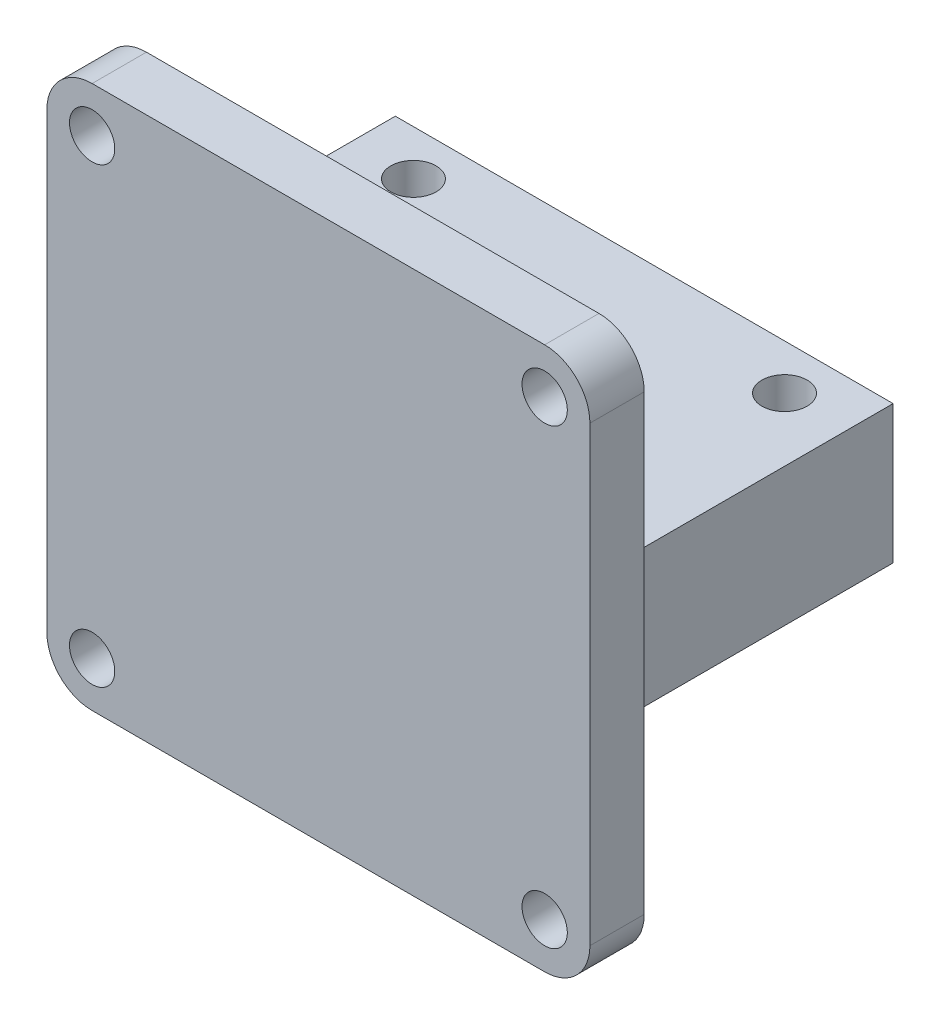
ISO-10303-21;
HEADER;
FILE_DESCRIPTION(('STEP AP214'),'2;1');
FILE_NAME('part.step','',(''),(''),'','','');
FILE_SCHEMA(('AUTOMOTIVE_DESIGN { 1 0 10303 214 1 1 1 1 }'));
ENDSEC;
DATA;
#1=APPLICATION_CONTEXT('core data for automotive mechanical design processes');
#2=APPLICATION_PROTOCOL_DEFINITION('international standard','automotive_design',2000,#1);
#3=PRODUCT_CONTEXT('',#1,'mechanical');
#4=PRODUCT('Part','Part','',(#3));
#5=PRODUCT_RELATED_PRODUCT_CATEGORY('part','',(#4));
#6=PRODUCT_DEFINITION_FORMATION('','',#4);
#7=PRODUCT_DEFINITION_CONTEXT('part definition',#1,'design');
#8=PRODUCT_DEFINITION('design','',#6,#7);
#9=PRODUCT_DEFINITION_SHAPE('','',#8);
#10=(LENGTH_UNIT() NAMED_UNIT(*) SI_UNIT(.MILLI.,.METRE.));
#11=(NAMED_UNIT(*) PLANE_ANGLE_UNIT() SI_UNIT($,.RADIAN.));
#12=(NAMED_UNIT(*) SI_UNIT($,.STERADIAN.) SOLID_ANGLE_UNIT());
#13=UNCERTAINTY_MEASURE_WITH_UNIT(LENGTH_MEASURE(1.E-05),#10,'distance_accuracy_value','');
#14=(GEOMETRIC_REPRESENTATION_CONTEXT(3) GLOBAL_UNCERTAINTY_ASSIGNED_CONTEXT((#13)) GLOBAL_UNIT_ASSIGNED_CONTEXT((#10,
#11,#12)) REPRESENTATION_CONTEXT('',''));
#15=CARTESIAN_POINT('',(0.,0.,0.));
#16=DIRECTION('',(0.,0.,1.));
#17=DIRECTION('',(1.,0.,0.));
#18=AXIS2_PLACEMENT_3D('',#15,#16,#17);
#19=CARTESIAN_POINT('',(0.,0.,0.));
#20=DIRECTION('',(0.,0.,1.));
#21=DIRECTION('',(1.,0.,0.));
#22=AXIS2_PLACEMENT_3D('',#19,#20,#21);
#23=PLANE('',#22);
#24=CARTESIAN_POINT('',(-25.,25.,0.));
#25=DIRECTION('',(0.,0.,-1.));
#26=DIRECTION('',(-1.,0.,0.));
#27=AXIS2_PLACEMENT_3D('',#24,#25,#26);
#28=CIRCLE('',#27,2.5);
#29=CARTESIAN_POINT('',(-27.5,25.,0.));
#30=VERTEX_POINT('',#29);
#31=EDGE_CURVE('E245',#30,#30,#28,.T.);
#32=ORIENTED_EDGE('',*,*,#31,.F.);
#33=EDGE_LOOP('',(#32));
#34=FACE_BOUND('',#33,.T.);
#35=CARTESIAN_POINT('',(25.,25.,0.));
#36=DIRECTION('',(0.,0.,-1.));
#37=DIRECTION('',(-1.,0.,0.));
#38=AXIS2_PLACEMENT_3D('',#35,#36,#37);
#39=CIRCLE('',#38,2.5);
#40=CARTESIAN_POINT('',(22.5,25.,0.));
#41=VERTEX_POINT('',#40);
#42=EDGE_CURVE('E280',#41,#41,#39,.T.);
#43=ORIENTED_EDGE('',*,*,#42,.F.);
#44=EDGE_LOOP('',(#43));
#45=FACE_BOUND('',#44,.T.);
#46=CARTESIAN_POINT('',(-25.,-25.,0.));
#47=DIRECTION('',(0.,0.,-1.));
#48=DIRECTION('',(-1.,0.,0.));
#49=AXIS2_PLACEMENT_3D('',#46,#47,#48);
#50=CIRCLE('',#49,2.5);
#51=CARTESIAN_POINT('',(-27.5,-25.,0.));
#52=VERTEX_POINT('',#51);
#53=EDGE_CURVE('E288',#52,#52,#50,.T.);
#54=ORIENTED_EDGE('',*,*,#53,.F.);
#55=EDGE_LOOP('',(#54));
#56=FACE_BOUND('',#55,.T.);
#57=CARTESIAN_POINT('',(25.,-25.,0.));
#58=DIRECTION('',(0.,0.,-1.));
#59=DIRECTION('',(-1.,0.,0.));
#60=AXIS2_PLACEMENT_3D('',#57,#58,#59);
#61=CIRCLE('',#60,2.5);
#62=CARTESIAN_POINT('',(22.5,-25.,0.));
#63=VERTEX_POINT('',#62);
#64=EDGE_CURVE('E296',#63,#63,#61,.T.);
#65=ORIENTED_EDGE('',*,*,#64,.F.);
#66=EDGE_LOOP('',(#65));
#67=FACE_BOUND('',#66,.T.);
#68=DIRECTION('',(0.,-1.,0.));
#69=VECTOR('',#68,1.);
#70=CARTESIAN_POINT('',(-30.,30.,0.));
#71=LINE('',#70,#69);
#72=CARTESIAN_POINT('',(-30.,25.,0.));
#73=VERTEX_POINT('',#72);
#74=CARTESIAN_POINT('',(-30.,-25.,0.));
#75=VERTEX_POINT('',#74);
#76=EDGE_CURVE('E191',#73,#75,#71,.T.);
#77=ORIENTED_EDGE('',*,*,#76,.F.);
#78=CARTESIAN_POINT('',(-25.,25.,0.));
#79=DIRECTION('',(0.,0.,1.));
#80=DIRECTION('',(1.,0.,0.));
#81=AXIS2_PLACEMENT_3D('',#78,#79,#80);
#82=CIRCLE('',#81,5.);
#83=CARTESIAN_POINT('',(-25.,30.,0.));
#84=VERTEX_POINT('',#83);
#85=EDGE_CURVE('E212',#73,#84,#82,.F.);
#86=ORIENTED_EDGE('',*,*,#85,.T.);
#87=DIRECTION('',(-1.,0.,0.));
#88=VECTOR('',#87,1.);
#89=CARTESIAN_POINT('',(-30.,30.,0.));
#90=LINE('',#89,#88);
#91=CARTESIAN_POINT('',(25.,30.,0.));
#92=VERTEX_POINT('',#91);
#93=EDGE_CURVE('E166',#92,#84,#90,.T.);
#94=ORIENTED_EDGE('',*,*,#93,.F.);
#95=CARTESIAN_POINT('',(25.,25.,0.));
#96=DIRECTION('',(0.,0.,1.));
#97=DIRECTION('',(1.,0.,0.));
#98=AXIS2_PLACEMENT_3D('',#95,#96,#97);
#99=CIRCLE('',#98,5.);
#100=CARTESIAN_POINT('',(30.,25.,0.));
#101=VERTEX_POINT('',#100);
#102=EDGE_CURVE('E203',#92,#101,#99,.F.);
#103=ORIENTED_EDGE('',*,*,#102,.T.);
#104=DIRECTION('',(0.,1.,0.));
#105=VECTOR('',#104,1.);
#106=CARTESIAN_POINT('',(30.,30.,0.));
#107=LINE('',#106,#105);
#108=CARTESIAN_POINT('',(30.,-25.,0.));
#109=VERTEX_POINT('',#108);
#110=EDGE_CURVE('E161',#109,#101,#107,.T.);
#111=ORIENTED_EDGE('',*,*,#110,.F.);
#112=CARTESIAN_POINT('',(25.,-25.,0.));
#113=DIRECTION('',(0.,0.,1.));
#114=DIRECTION('',(1.,0.,0.));
#115=AXIS2_PLACEMENT_3D('',#112,#113,#114);
#116=CIRCLE('',#115,5.);
#117=CARTESIAN_POINT('',(25.,-30.,0.));
#118=VERTEX_POINT('',#117);
#119=EDGE_CURVE('E206',#109,#118,#116,.F.);
#120=ORIENTED_EDGE('',*,*,#119,.T.);
#121=DIRECTION('',(1.,0.,0.));
#122=VECTOR('',#121,1.);
#123=CARTESIAN_POINT('',(-30.,-30.,0.));
#124=LINE('',#123,#122);
#125=CARTESIAN_POINT('',(-25.,-30.,0.));
#126=VERTEX_POINT('',#125);
#127=EDGE_CURVE('E177',#126,#118,#124,.T.);
#128=ORIENTED_EDGE('',*,*,#127,.F.);
#129=CARTESIAN_POINT('',(-25.,-25.,0.));
#130=DIRECTION('',(0.,0.,1.));
#131=DIRECTION('',(1.,0.,0.));
#132=AXIS2_PLACEMENT_3D('',#129,#130,#131);
#133=CIRCLE('',#132,5.);
#134=EDGE_CURVE('E209',#126,#75,#133,.F.);
#135=ORIENTED_EDGE('',*,*,#134,.T.);
#136=EDGE_LOOP('',(#77,#86,#94,#103,#111,#120,#128,#135));
#137=FACE_BOUND('',#136,.T.);
#138=DIRECTION('',(0.,1.,0.));
#139=VECTOR('',#138,1.);
#140=CARTESIAN_POINT('',(-27.5,7.625,0.));
#141=LINE('',#140,#139);
#142=CARTESIAN_POINT('',(-27.5,-7.625,0.));
#143=VERTEX_POINT('',#142);
#144=CARTESIAN_POINT('',(-27.5,7.625,0.));
#145=VERTEX_POINT('',#144);
#146=EDGE_CURVE('E159',#143,#145,#141,.T.);
#147=ORIENTED_EDGE('',*,*,#146,.F.);
#148=DIRECTION('',(-1.,0.,0.));
#149=VECTOR('',#148,1.);
#150=CARTESIAN_POINT('',(27.5,-7.625,0.));
#151=LINE('',#150,#149);
#152=CARTESIAN_POINT('',(27.5,-7.625,0.));
#153=VERTEX_POINT('',#152);
#154=EDGE_CURVE('E156',#153,#143,#151,.T.);
#155=ORIENTED_EDGE('',*,*,#154,.F.);
#156=DIRECTION('',(0.,-1.,0.));
#157=VECTOR('',#156,1.);
#158=CARTESIAN_POINT('',(27.5,7.625,0.));
#159=LINE('',#158,#157);
#160=CARTESIAN_POINT('',(27.5,7.625,0.));
#161=VERTEX_POINT('',#160);
#162=EDGE_CURVE('E314',#161,#153,#159,.T.);
#163=ORIENTED_EDGE('',*,*,#162,.F.);
#164=DIRECTION('',(1.,0.,0.));
#165=VECTOR('',#164,1.);
#166=CARTESIAN_POINT('',(27.5,7.625,0.));
#167=LINE('',#166,#165);
#168=EDGE_CURVE('E311',#145,#161,#167,.T.);
#169=ORIENTED_EDGE('',*,*,#168,.F.);
#170=EDGE_LOOP('',(#147,#155,#163,#169));
#171=FACE_BOUND('',#170,.T.);
#172=ADVANCED_FACE('F39',(#34,#45,#56,#67,#137,#171),#23,.F.);
#173=CARTESIAN_POINT('',(30.,30.,6.));
#174=DIRECTION('',(-1.,0.,0.));
#175=DIRECTION('',(0.,-1.,0.));
#176=AXIS2_PLACEMENT_3D('',#173,#174,#175);
#177=PLANE('',#176);
#178=DIRECTION('',(0.,1.,0.));
#179=VECTOR('',#178,1.);
#180=CARTESIAN_POINT('',(30.,30.,6.));
#181=LINE('',#180,#179);
#182=CARTESIAN_POINT('',(30.,-25.,6.));
#183=VERTEX_POINT('',#182);
#184=CARTESIAN_POINT('',(30.,25.,6.));
#185=VERTEX_POINT('',#184);
#186=EDGE_CURVE('E172',#183,#185,#181,.T.);
#187=ORIENTED_EDGE('',*,*,#186,.F.);
#188=DIRECTION('',(0.,0.,-1.));
#189=VECTOR('',#188,1.);
#190=CARTESIAN_POINT('',(30.,-25.,6.));
#191=LINE('',#190,#189);
#192=EDGE_CURVE('E11',#183,#109,#191,.T.);
#193=ORIENTED_EDGE('',*,*,#192,.T.);
#194=ORIENTED_EDGE('',*,*,#110,.T.);
#195=DIRECTION('',(0.,0.,-1.));
#196=VECTOR('',#195,1.);
#197=CARTESIAN_POINT('',(30.,25.,6.));
#198=LINE('',#197,#196);
#199=EDGE_CURVE('E49',#101,#185,#198,.F.);
#200=ORIENTED_EDGE('',*,*,#199,.T.);
#201=EDGE_LOOP('',(#187,#193,#194,#200));
#202=FACE_BOUND('',#201,.T.);
#203=ADVANCED_FACE('F331',(#202),#177,.F.);
#204=CARTESIAN_POINT('',(-30.,30.,6.));
#205=DIRECTION('',(0.,-1.,0.));
#206=DIRECTION('',(0.,0.,-1.));
#207=AXIS2_PLACEMENT_3D('',#204,#205,#206);
#208=PLANE('',#207);
#209=ORIENTED_EDGE('',*,*,#93,.T.);
#210=DIRECTION('',(0.,0.,-1.));
#211=VECTOR('',#210,1.);
#212=CARTESIAN_POINT('',(-25.,30.,6.));
#213=LINE('',#212,#211);
#214=CARTESIAN_POINT('',(-25.,30.,6.));
#215=VERTEX_POINT('',#214);
#216=EDGE_CURVE('E219',#84,#215,#213,.F.);
#217=ORIENTED_EDGE('',*,*,#216,.T.);
#218=DIRECTION('',(-1.,0.,0.));
#219=VECTOR('',#218,1.);
#220=CARTESIAN_POINT('',(-30.,30.,6.));
#221=LINE('',#220,#219);
#222=CARTESIAN_POINT('',(25.,30.,6.));
#223=VERTEX_POINT('',#222);
#224=EDGE_CURVE('E176',#223,#215,#221,.T.);
#225=ORIENTED_EDGE('',*,*,#224,.F.);
#226=DIRECTION('',(0.,0.,-1.));
#227=VECTOR('',#226,1.);
#228=CARTESIAN_POINT('',(25.,30.,6.));
#229=LINE('',#228,#227);
#230=EDGE_CURVE('E215',#223,#92,#229,.T.);
#231=ORIENTED_EDGE('',*,*,#230,.T.);
#232=EDGE_LOOP('',(#209,#217,#225,#231));
#233=FACE_BOUND('',#232,.T.);
#234=ADVANCED_FACE('F337',(#233),#208,.F.);
#235=CARTESIAN_POINT('',(-30.,30.,6.));
#236=DIRECTION('',(1.,0.,0.));
#237=DIRECTION('',(0.,1.,0.));
#238=AXIS2_PLACEMENT_3D('',#235,#236,#237);
#239=PLANE('',#238);
#240=DIRECTION('',(0.,-1.,0.));
#241=VECTOR('',#240,1.);
#242=CARTESIAN_POINT('',(-30.,30.,6.));
#243=LINE('',#242,#241);
#244=CARTESIAN_POINT('',(-30.,25.,6.));
#245=VERTEX_POINT('',#244);
#246=CARTESIAN_POINT('',(-30.,-25.,6.));
#247=VERTEX_POINT('',#246);
#248=EDGE_CURVE('E181',#245,#247,#243,.T.);
#249=ORIENTED_EDGE('',*,*,#248,.F.);
#250=DIRECTION('',(0.,0.,-1.));
#251=VECTOR('',#250,1.);
#252=CARTESIAN_POINT('',(-30.,25.,6.));
#253=LINE('',#252,#251);
#254=EDGE_CURVE('E199',#245,#73,#253,.T.);
#255=ORIENTED_EDGE('',*,*,#254,.T.);
#256=ORIENTED_EDGE('',*,*,#76,.T.);
#257=DIRECTION('',(0.,0.,-1.));
#258=VECTOR('',#257,1.);
#259=CARTESIAN_POINT('',(-30.,-25.,6.));
#260=LINE('',#259,#258);
#261=EDGE_CURVE('E186',#75,#247,#260,.F.);
#262=ORIENTED_EDGE('',*,*,#261,.T.);
#263=EDGE_LOOP('',(#249,#255,#256,#262));
#264=FACE_BOUND('',#263,.T.);
#265=ADVANCED_FACE('F349',(#264),#239,.F.);
#266=CARTESIAN_POINT('',(-30.,-30.,6.));
#267=DIRECTION('',(0.,1.,0.));
#268=DIRECTION('',(0.,0.,1.));
#269=AXIS2_PLACEMENT_3D('',#266,#267,#268);
#270=PLANE('',#269);
#271=DIRECTION('',(1.,0.,0.));
#272=VECTOR('',#271,1.);
#273=CARTESIAN_POINT('',(-30.,-30.,6.));
#274=LINE('',#273,#272);
#275=CARTESIAN_POINT('',(-25.,-30.,6.));
#276=VERTEX_POINT('',#275);
#277=CARTESIAN_POINT('',(25.,-30.,6.));
#278=VERTEX_POINT('',#277);
#279=EDGE_CURVE('E184',#276,#278,#274,.T.);
#280=ORIENTED_EDGE('',*,*,#279,.F.);
#281=DIRECTION('',(0.,0.,-1.));
#282=VECTOR('',#281,1.);
#283=CARTESIAN_POINT('',(-25.,-30.,6.));
#284=LINE('',#283,#282);
#285=EDGE_CURVE('E235',#276,#126,#284,.T.);
#286=ORIENTED_EDGE('',*,*,#285,.T.);
#287=ORIENTED_EDGE('',*,*,#127,.T.);
#288=DIRECTION('',(0.,0.,-1.));
#289=VECTOR('',#288,1.);
#290=CARTESIAN_POINT('',(25.,-30.,6.));
#291=LINE('',#290,#289);
#292=EDGE_CURVE('E57',#118,#278,#291,.F.);
#293=ORIENTED_EDGE('',*,*,#292,.T.);
#294=EDGE_LOOP('',(#280,#286,#287,#293));
#295=FACE_BOUND('',#294,.T.);
#296=ADVANCED_FACE('F346',(#295),#270,.F.);
#297=CARTESIAN_POINT('',(0.,0.,6.));
#298=DIRECTION('',(0.,0.,1.));
#299=DIRECTION('',(1.,0.,0.));
#300=AXIS2_PLACEMENT_3D('',#297,#298,#299);
#301=PLANE('',#300);
#302=CARTESIAN_POINT('',(-25.,25.,6.));
#303=DIRECTION('',(0.,0.,-1.));
#304=DIRECTION('',(-1.,0.,0.));
#305=AXIS2_PLACEMENT_3D('',#302,#303,#304);
#306=CIRCLE('',#305,2.5);
#307=CARTESIAN_POINT('',(-27.5,25.,6.));
#308=VERTEX_POINT('',#307);
#309=EDGE_CURVE('E276',#308,#308,#306,.T.);
#310=ORIENTED_EDGE('',*,*,#309,.T.);
#311=EDGE_LOOP('',(#310));
#312=FACE_BOUND('',#311,.T.);
#313=CARTESIAN_POINT('',(25.,25.,6.));
#314=DIRECTION('',(0.,0.,-1.));
#315=DIRECTION('',(-1.,0.,0.));
#316=AXIS2_PLACEMENT_3D('',#313,#314,#315);
#317=CIRCLE('',#316,2.5);
#318=CARTESIAN_POINT('',(22.5,25.,6.));
#319=VERTEX_POINT('',#318);
#320=EDGE_CURVE('E284',#319,#319,#317,.T.);
#321=ORIENTED_EDGE('',*,*,#320,.T.);
#322=EDGE_LOOP('',(#321));
#323=FACE_BOUND('',#322,.T.);
#324=CARTESIAN_POINT('',(-25.,-25.,6.));
#325=DIRECTION('',(0.,0.,-1.));
#326=DIRECTION('',(-1.,0.,0.));
#327=AXIS2_PLACEMENT_3D('',#324,#325,#326);
#328=CIRCLE('',#327,2.5);
#329=CARTESIAN_POINT('',(-27.5,-25.,6.));
#330=VERTEX_POINT('',#329);
#331=EDGE_CURVE('E292',#330,#330,#328,.T.);
#332=ORIENTED_EDGE('',*,*,#331,.T.);
#333=EDGE_LOOP('',(#332));
#334=FACE_BOUND('',#333,.T.);
#335=CARTESIAN_POINT('',(25.,-25.,6.));
#336=DIRECTION('',(0.,0.,-1.));
#337=DIRECTION('',(-1.,0.,0.));
#338=AXIS2_PLACEMENT_3D('',#335,#336,#337);
#339=CIRCLE('',#338,2.5);
#340=CARTESIAN_POINT('',(22.5,-25.,6.));
#341=VERTEX_POINT('',#340);
#342=EDGE_CURVE('E300',#341,#341,#339,.T.);
#343=ORIENTED_EDGE('',*,*,#342,.T.);
#344=EDGE_LOOP('',(#343));
#345=FACE_BOUND('',#344,.T.);
#346=ORIENTED_EDGE('',*,*,#224,.T.);
#347=CARTESIAN_POINT('',(-25.,25.,6.));
#348=DIRECTION('',(0.,0.,1.));
#349=DIRECTION('',(1.,0.,0.));
#350=AXIS2_PLACEMENT_3D('',#347,#348,#349);
#351=CIRCLE('',#350,5.);
#352=EDGE_CURVE('E230',#215,#245,#351,.T.);
#353=ORIENTED_EDGE('',*,*,#352,.T.);
#354=ORIENTED_EDGE('',*,*,#248,.T.);
#355=CARTESIAN_POINT('',(-25.,-25.,6.));
#356=DIRECTION('',(0.,0.,1.));
#357=DIRECTION('',(1.,0.,0.));
#358=AXIS2_PLACEMENT_3D('',#355,#356,#357);
#359=CIRCLE('',#358,5.);
#360=EDGE_CURVE('E64',#247,#276,#359,.T.);
#361=ORIENTED_EDGE('',*,*,#360,.T.);
#362=ORIENTED_EDGE('',*,*,#279,.T.);
#363=CARTESIAN_POINT('',(25.,-25.,6.));
#364=DIRECTION('',(0.,0.,1.));
#365=DIRECTION('',(1.,0.,0.));
#366=AXIS2_PLACEMENT_3D('',#363,#364,#365);
#367=CIRCLE('',#366,5.);
#368=EDGE_CURVE('E225',#278,#183,#367,.T.);
#369=ORIENTED_EDGE('',*,*,#368,.T.);
#370=ORIENTED_EDGE('',*,*,#186,.T.);
#371=CARTESIAN_POINT('',(25.,25.,6.));
#372=DIRECTION('',(0.,0.,1.));
#373=DIRECTION('',(1.,0.,0.));
#374=AXIS2_PLACEMENT_3D('',#371,#372,#373);
#375=CIRCLE('',#374,5.);
#376=EDGE_CURVE('E222',#185,#223,#375,.T.);
#377=ORIENTED_EDGE('',*,*,#376,.T.);
#378=EDGE_LOOP('',(#346,#353,#354,#361,#362,#369,#370,#377));
#379=FACE_BOUND('',#378,.T.);
#380=ADVANCED_FACE('F344',(#312,#323,#334,#345,#379),#301,.T.);
#381=CARTESIAN_POINT('',(-27.5,7.625,-30.));
#382=DIRECTION('',(1.,0.,0.));
#383=DIRECTION('',(0.,1.,0.));
#384=AXIS2_PLACEMENT_3D('',#381,#382,#383);
#385=PLANE('',#384);
#386=ORIENTED_EDGE('',*,*,#146,.T.);
#387=DIRECTION('',(0.,0.,1.));
#388=VECTOR('',#387,1.);
#389=CARTESIAN_POINT('',(-27.5,7.625,-30.));
#390=LINE('',#389,#388);
#391=CARTESIAN_POINT('',(-27.5,7.625,-30.));
#392=VERTEX_POINT('',#391);
#393=EDGE_CURVE('E138',#392,#145,#390,.T.);
#394=ORIENTED_EDGE('',*,*,#393,.F.);
#395=DIRECTION('',(0.,1.,0.));
#396=VECTOR('',#395,1.);
#397=CARTESIAN_POINT('',(-27.5,7.625,-30.));
#398=LINE('',#397,#396);
#399=CARTESIAN_POINT('',(-27.5,-7.625,-30.));
#400=VERTEX_POINT('',#399);
#401=EDGE_CURVE('E146',#400,#392,#398,.T.);
#402=ORIENTED_EDGE('',*,*,#401,.F.);
#403=DIRECTION('',(0.,0.,1.));
#404=VECTOR('',#403,1.);
#405=CARTESIAN_POINT('',(-27.5,-7.625,-30.));
#406=LINE('',#405,#404);
#407=EDGE_CURVE('E308',#400,#143,#406,.T.);
#408=ORIENTED_EDGE('',*,*,#407,.T.);
#409=EDGE_LOOP('',(#386,#394,#402,#408));
#410=FACE_BOUND('',#409,.T.);
#411=ADVANCED_FACE('F158',(#410),#385,.F.);
#412=CARTESIAN_POINT('',(27.5,7.625,-30.));
#413=DIRECTION('',(0.,-1.,0.));
#414=DIRECTION('',(0.,0.,-1.));
#415=AXIS2_PLACEMENT_3D('',#412,#413,#414);
#416=PLANE('',#415);
#417=CARTESIAN_POINT('',(20.5,7.625,-25.));
#418=DIRECTION('',(0.,1.,0.));
#419=DIRECTION('',(0.,0.,1.));
#420=AXIS2_PLACEMENT_3D('',#417,#418,#419);
#421=CIRCLE('',#420,2.49999999999999);
#422=CARTESIAN_POINT('',(20.5,7.625,-22.5));
#423=VERTEX_POINT('',#422);
#424=EDGE_CURVE('E267',#423,#423,#421,.T.);
#425=ORIENTED_EDGE('',*,*,#424,.F.);
#426=EDGE_LOOP('',(#425));
#427=FACE_BOUND('',#426,.T.);
#428=CARTESIAN_POINT('',(20.5,7.625,-5.00000000000001));
#429=DIRECTION('',(0.,1.,0.));
#430=DIRECTION('',(0.,0.,1.));
#431=AXIS2_PLACEMENT_3D('',#428,#429,#430);
#432=CIRCLE('',#431,2.49999999999999);
#433=CARTESIAN_POINT('',(20.5,7.625,-2.50000000000002));
#434=VERTEX_POINT('',#433);
#435=EDGE_CURVE('E254',#434,#434,#432,.T.);
#436=ORIENTED_EDGE('',*,*,#435,.F.);
#437=EDGE_LOOP('',(#436));
#438=FACE_BOUND('',#437,.T.);
#439=CARTESIAN_POINT('',(-20.5,7.625,-5.00000000000001));
#440=DIRECTION('',(0.,1.,0.));
#441=DIRECTION('',(0.,0.,1.));
#442=AXIS2_PLACEMENT_3D('',#439,#440,#441);
#443=CIRCLE('',#442,2.49999999999999);
#444=CARTESIAN_POINT('',(-20.5,7.625,-2.50000000000002));
#445=VERTEX_POINT('',#444);
#446=EDGE_CURVE('E250',#445,#445,#443,.T.);
#447=ORIENTED_EDGE('',*,*,#446,.F.);
#448=EDGE_LOOP('',(#447));
#449=FACE_BOUND('',#448,.T.);
#450=CARTESIAN_POINT('',(-20.5,7.625,-25.));
#451=DIRECTION('',(0.,1.,0.));
#452=DIRECTION('',(0.,0.,1.));
#453=AXIS2_PLACEMENT_3D('',#450,#451,#452);
#454=CIRCLE('',#453,2.49999999999999);
#455=CARTESIAN_POINT('',(-20.5,7.625,-22.5));
#456=VERTEX_POINT('',#455);
#457=EDGE_CURVE('E246',#456,#456,#454,.T.);
#458=ORIENTED_EDGE('',*,*,#457,.F.);
#459=EDGE_LOOP('',(#458));
#460=FACE_BOUND('',#459,.T.);
#461=ORIENTED_EDGE('',*,*,#168,.T.);
#462=DIRECTION('',(0.,0.,1.));
#463=VECTOR('',#462,1.);
#464=CARTESIAN_POINT('',(27.5,7.625,-30.));
#465=LINE('',#464,#463);
#466=CARTESIAN_POINT('',(27.5,7.625,-30.));
#467=VERTEX_POINT('',#466);
#468=EDGE_CURVE('E141',#467,#161,#465,.T.);
#469=ORIENTED_EDGE('',*,*,#468,.F.);
#470=DIRECTION('',(1.,0.,0.));
#471=VECTOR('',#470,1.);
#472=CARTESIAN_POINT('',(27.5,7.625,-30.));
#473=LINE('',#472,#471);
#474=EDGE_CURVE('E133',#392,#467,#473,.T.);
#475=ORIENTED_EDGE('',*,*,#474,.F.);
#476=ORIENTED_EDGE('',*,*,#393,.T.);
#477=EDGE_LOOP('',(#461,#469,#475,#476));
#478=FACE_BOUND('',#477,.T.);
#479=ADVANCED_FACE('F136',(#427,#438,#449,#460,#478),#416,.F.);
#480=CARTESIAN_POINT('',(27.5,7.625,-30.));
#481=DIRECTION('',(-1.,0.,0.));
#482=DIRECTION('',(0.,-1.,0.));
#483=AXIS2_PLACEMENT_3D('',#480,#481,#482);
#484=PLANE('',#483);
#485=ORIENTED_EDGE('',*,*,#162,.T.);
#486=DIRECTION('',(0.,0.,1.));
#487=VECTOR('',#486,1.);
#488=CARTESIAN_POINT('',(27.5,-7.625,-30.));
#489=LINE('',#488,#487);
#490=CARTESIAN_POINT('',(27.5,-7.625,-30.));
#491=VERTEX_POINT('',#490);
#492=EDGE_CURVE('E168',#491,#153,#489,.T.);
#493=ORIENTED_EDGE('',*,*,#492,.F.);
#494=DIRECTION('',(0.,-1.,0.));
#495=VECTOR('',#494,1.);
#496=CARTESIAN_POINT('',(27.5,7.625,-30.));
#497=LINE('',#496,#495);
#498=EDGE_CURVE('E145',#467,#491,#497,.T.);
#499=ORIENTED_EDGE('',*,*,#498,.F.);
#500=ORIENTED_EDGE('',*,*,#468,.T.);
#501=EDGE_LOOP('',(#485,#493,#499,#500));
#502=FACE_BOUND('',#501,.T.);
#503=ADVANCED_FACE('F328',(#502),#484,.F.);
#504=CARTESIAN_POINT('',(27.5,-7.625,-30.));
#505=DIRECTION('',(0.,1.,0.));
#506=DIRECTION('',(0.,0.,1.));
#507=AXIS2_PLACEMENT_3D('',#504,#505,#506);
#508=PLANE('',#507);
#509=CARTESIAN_POINT('',(20.5,-7.625,-25.));
#510=DIRECTION('',(0.,1.,0.));
#511=DIRECTION('',(0.,0.,1.));
#512=AXIS2_PLACEMENT_3D('',#509,#510,#511);
#513=CIRCLE('',#512,2.49999999999999);
#514=CARTESIAN_POINT('',(20.5,-7.625,-22.5));
#515=VERTEX_POINT('',#514);
#516=EDGE_CURVE('E43',#515,#515,#513,.T.);
#517=ORIENTED_EDGE('',*,*,#516,.T.);
#518=EDGE_LOOP('',(#517));
#519=FACE_BOUND('',#518,.T.);
#520=CARTESIAN_POINT('',(20.5,-7.625,-5.00000000000001));
#521=DIRECTION('',(0.,1.,0.));
#522=DIRECTION('',(0.,0.,1.));
#523=AXIS2_PLACEMENT_3D('',#520,#521,#522);
#524=CIRCLE('',#523,2.49999999999999);
#525=CARTESIAN_POINT('',(20.5,-7.625,-2.50000000000002));
#526=VERTEX_POINT('',#525);
#527=EDGE_CURVE('E251',#526,#526,#524,.T.);
#528=ORIENTED_EDGE('',*,*,#527,.T.);
#529=EDGE_LOOP('',(#528));
#530=FACE_BOUND('',#529,.T.);
#531=CARTESIAN_POINT('',(-20.5,-7.625,-5.00000000000001));
#532=DIRECTION('',(0.,1.,0.));
#533=DIRECTION('',(0.,0.,1.));
#534=AXIS2_PLACEMENT_3D('',#531,#532,#533);
#535=CIRCLE('',#534,2.49999999999999);
#536=CARTESIAN_POINT('',(-20.5,-7.625,-2.50000000000002));
#537=VERTEX_POINT('',#536);
#538=EDGE_CURVE('E247',#537,#537,#535,.T.);
#539=ORIENTED_EDGE('',*,*,#538,.T.);
#540=EDGE_LOOP('',(#539));
#541=FACE_BOUND('',#540,.T.);
#542=CARTESIAN_POINT('',(-20.5,-7.625,-25.));
#543=DIRECTION('',(0.,1.,0.));
#544=DIRECTION('',(0.,0.,1.));
#545=AXIS2_PLACEMENT_3D('',#542,#543,#544);
#546=CIRCLE('',#545,2.49999999999999);
#547=CARTESIAN_POINT('',(-20.5,-7.625,-22.5));
#548=VERTEX_POINT('',#547);
#549=EDGE_CURVE('E241',#548,#548,#546,.T.);
#550=ORIENTED_EDGE('',*,*,#549,.T.);
#551=EDGE_LOOP('',(#550));
#552=FACE_BOUND('',#551,.T.);
#553=ORIENTED_EDGE('',*,*,#154,.T.);
#554=ORIENTED_EDGE('',*,*,#407,.F.);
#555=DIRECTION('',(-1.,0.,0.));
#556=VECTOR('',#555,1.);
#557=CARTESIAN_POINT('',(27.5,-7.625,-30.));
#558=LINE('',#557,#556);
#559=EDGE_CURVE('E151',#491,#400,#558,.T.);
#560=ORIENTED_EDGE('',*,*,#559,.F.);
#561=ORIENTED_EDGE('',*,*,#492,.T.);
#562=EDGE_LOOP('',(#553,#554,#560,#561));
#563=FACE_BOUND('',#562,.T.);
#564=ADVANCED_FACE('F326',(#519,#530,#541,#552,#563),#508,.F.);
#565=CARTESIAN_POINT('',(0.,0.,-30.));
#566=DIRECTION('',(0.,0.,-1.));
#567=DIRECTION('',(-1.,0.,0.));
#568=AXIS2_PLACEMENT_3D('',#565,#566,#567);
#569=PLANE('',#568);
#570=ORIENTED_EDGE('',*,*,#401,.T.);
#571=ORIENTED_EDGE('',*,*,#474,.T.);
#572=ORIENTED_EDGE('',*,*,#498,.T.);
#573=ORIENTED_EDGE('',*,*,#559,.T.);
#574=EDGE_LOOP('',(#570,#571,#572,#573));
#575=FACE_BOUND('',#574,.T.);
#576=ADVANCED_FACE('F149',(#575),#569,.T.);
#577=CARTESIAN_POINT('',(25.,-25.,0.));
#578=DIRECTION('',(0.,0.,-1.));
#579=DIRECTION('',(-1.,0.,0.));
#580=AXIS2_PLACEMENT_3D('',#577,#578,#579);
#581=CYLINDRICAL_SURFACE('',#580,2.5);
#582=ORIENTED_EDGE('',*,*,#342,.F.);
#583=EDGE_LOOP('',(#582));
#584=FACE_BOUND('',#583,.T.);
#585=ORIENTED_EDGE('',*,*,#64,.T.);
#586=EDGE_LOOP('',(#585));
#587=FACE_BOUND('',#586,.T.);
#588=ADVANCED_FACE('F403',(#584,#587),#581,.F.);
#589=CARTESIAN_POINT('',(-25.,-25.,0.));
#590=DIRECTION('',(0.,0.,-1.));
#591=DIRECTION('',(-1.,0.,0.));
#592=AXIS2_PLACEMENT_3D('',#589,#590,#591);
#593=CYLINDRICAL_SURFACE('',#592,2.5);
#594=ORIENTED_EDGE('',*,*,#331,.F.);
#595=EDGE_LOOP('',(#594));
#596=FACE_BOUND('',#595,.T.);
#597=ORIENTED_EDGE('',*,*,#53,.T.);
#598=EDGE_LOOP('',(#597));
#599=FACE_BOUND('',#598,.T.);
#600=ADVANCED_FACE('F406',(#596,#599),#593,.F.);
#601=CARTESIAN_POINT('',(25.,25.,0.));
#602=DIRECTION('',(0.,0.,-1.));
#603=DIRECTION('',(-1.,0.,0.));
#604=AXIS2_PLACEMENT_3D('',#601,#602,#603);
#605=CYLINDRICAL_SURFACE('',#604,2.5);
#606=ORIENTED_EDGE('',*,*,#320,.F.);
#607=EDGE_LOOP('',(#606));
#608=FACE_BOUND('',#607,.T.);
#609=ORIENTED_EDGE('',*,*,#42,.T.);
#610=EDGE_LOOP('',(#609));
#611=FACE_BOUND('',#610,.T.);
#612=ADVANCED_FACE('F414',(#608,#611),#605,.F.);
#613=CARTESIAN_POINT('',(-25.,25.,0.));
#614=DIRECTION('',(0.,0.,-1.));
#615=DIRECTION('',(-1.,0.,0.));
#616=AXIS2_PLACEMENT_3D('',#613,#614,#615);
#617=CYLINDRICAL_SURFACE('',#616,2.5);
#618=ORIENTED_EDGE('',*,*,#309,.F.);
#619=EDGE_LOOP('',(#618));
#620=FACE_BOUND('',#619,.T.);
#621=ORIENTED_EDGE('',*,*,#31,.T.);
#622=EDGE_LOOP('',(#621));
#623=FACE_BOUND('',#622,.T.);
#624=ADVANCED_FACE('F360',(#620,#623),#617,.F.);
#625=CARTESIAN_POINT('',(-25.,25.,6.));
#626=DIRECTION('',(0.,0.,-1.));
#627=DIRECTION('',(-1.,0.,0.));
#628=AXIS2_PLACEMENT_3D('',#625,#626,#627);
#629=CYLINDRICAL_SURFACE('',#628,5.);
#630=ORIENTED_EDGE('',*,*,#352,.F.);
#631=ORIENTED_EDGE('',*,*,#216,.F.);
#632=ORIENTED_EDGE('',*,*,#85,.F.);
#633=ORIENTED_EDGE('',*,*,#254,.F.);
#634=EDGE_LOOP('',(#630,#631,#632,#633));
#635=FACE_BOUND('',#634,.T.);
#636=ADVANCED_FACE('F356',(#635),#629,.T.);
#637=CARTESIAN_POINT('',(-25.,-25.,6.));
#638=DIRECTION('',(0.,0.,-1.));
#639=DIRECTION('',(-1.,0.,0.));
#640=AXIS2_PLACEMENT_3D('',#637,#638,#639);
#641=CYLINDRICAL_SURFACE('',#640,5.);
#642=ORIENTED_EDGE('',*,*,#360,.F.);
#643=ORIENTED_EDGE('',*,*,#261,.F.);
#644=ORIENTED_EDGE('',*,*,#134,.F.);
#645=ORIENTED_EDGE('',*,*,#285,.F.);
#646=EDGE_LOOP('',(#642,#643,#644,#645));
#647=FACE_BOUND('',#646,.T.);
#648=ADVANCED_FACE('F359',(#647),#641,.T.);
#649=CARTESIAN_POINT('',(25.,-25.,6.));
#650=DIRECTION('',(0.,0.,-1.));
#651=DIRECTION('',(-1.,0.,0.));
#652=AXIS2_PLACEMENT_3D('',#649,#650,#651);
#653=CYLINDRICAL_SURFACE('',#652,5.);
#654=ORIENTED_EDGE('',*,*,#368,.F.);
#655=ORIENTED_EDGE('',*,*,#292,.F.);
#656=ORIENTED_EDGE('',*,*,#119,.F.);
#657=ORIENTED_EDGE('',*,*,#192,.F.);
#658=EDGE_LOOP('',(#654,#655,#656,#657));
#659=FACE_BOUND('',#658,.T.);
#660=ADVANCED_FACE('F363',(#659),#653,.T.);
#661=CARTESIAN_POINT('',(25.,25.,6.));
#662=DIRECTION('',(0.,0.,-1.));
#663=DIRECTION('',(-1.,0.,0.));
#664=AXIS2_PLACEMENT_3D('',#661,#662,#663);
#665=CYLINDRICAL_SURFACE('',#664,5.);
#666=ORIENTED_EDGE('',*,*,#376,.F.);
#667=ORIENTED_EDGE('',*,*,#199,.F.);
#668=ORIENTED_EDGE('',*,*,#102,.F.);
#669=ORIENTED_EDGE('',*,*,#230,.F.);
#670=EDGE_LOOP('',(#666,#667,#668,#669));
#671=FACE_BOUND('',#670,.T.);
#672=ADVANCED_FACE('F41',(#671),#665,.T.);
#673=CARTESIAN_POINT('',(-20.5,7.625,-25.));
#674=DIRECTION('',(0.,1.,0.));
#675=DIRECTION('',(0.,0.,1.));
#676=AXIS2_PLACEMENT_3D('',#673,#674,#675);
#677=CYLINDRICAL_SURFACE('',#676,2.49999999999999);
#678=ORIENTED_EDGE('',*,*,#457,.T.);
#679=EDGE_LOOP('',(#678));
#680=FACE_BOUND('',#679,.T.);
#681=ORIENTED_EDGE('',*,*,#549,.F.);
#682=EDGE_LOOP('',(#681));
#683=FACE_BOUND('',#682,.T.);
#684=ADVANCED_FACE('F370',(#680,#683),#677,.F.);
#685=CARTESIAN_POINT('',(-20.5,7.625,-5.00000000000001));
#686=DIRECTION('',(0.,1.,0.));
#687=DIRECTION('',(0.,0.,1.));
#688=AXIS2_PLACEMENT_3D('',#685,#686,#687);
#689=CYLINDRICAL_SURFACE('',#688,2.49999999999999);
#690=ORIENTED_EDGE('',*,*,#446,.T.);
#691=EDGE_LOOP('',(#690));
#692=FACE_BOUND('',#691,.T.);
#693=ORIENTED_EDGE('',*,*,#538,.F.);
#694=EDGE_LOOP('',(#693));
#695=FACE_BOUND('',#694,.T.);
#696=ADVANCED_FACE('F439',(#692,#695),#689,.F.);
#697=CARTESIAN_POINT('',(20.5,7.625,-5.00000000000001));
#698=DIRECTION('',(0.,1.,0.));
#699=DIRECTION('',(0.,0.,1.));
#700=AXIS2_PLACEMENT_3D('',#697,#698,#699);
#701=CYLINDRICAL_SURFACE('',#700,2.49999999999999);
#702=ORIENTED_EDGE('',*,*,#435,.T.);
#703=EDGE_LOOP('',(#702));
#704=FACE_BOUND('',#703,.T.);
#705=ORIENTED_EDGE('',*,*,#527,.F.);
#706=EDGE_LOOP('',(#705));
#707=FACE_BOUND('',#706,.T.);
#708=ADVANCED_FACE('F446',(#704,#707),#701,.F.);
#709=CARTESIAN_POINT('',(20.5,7.625,-25.));
#710=DIRECTION('',(0.,1.,0.));
#711=DIRECTION('',(0.,0.,1.));
#712=AXIS2_PLACEMENT_3D('',#709,#710,#711);
#713=CYLINDRICAL_SURFACE('',#712,2.49999999999999);
#714=ORIENTED_EDGE('',*,*,#424,.T.);
#715=EDGE_LOOP('',(#714));
#716=FACE_BOUND('',#715,.T.);
#717=ORIENTED_EDGE('',*,*,#516,.F.);
#718=EDGE_LOOP('',(#717));
#719=FACE_BOUND('',#718,.T.);
#720=ADVANCED_FACE('F518',(#716,#719),#713,.F.);
#721=CLOSED_SHELL('',(#172,#203,#234,#265,#296,#380,#411,#479,#503,#564,#576,#588,#600,#612,
#624,#636,#648,#660,#672,#684,#696,#708,#720));
#722=MANIFOLD_SOLID_BREP('B2',#721);
#723=ADVANCED_BREP_SHAPE_REPRESENTATION('',(#18,#722),#14);
#724=SHAPE_DEFINITION_REPRESENTATION(#9,#723);
ENDSEC;
END-ISO-10303-21;
